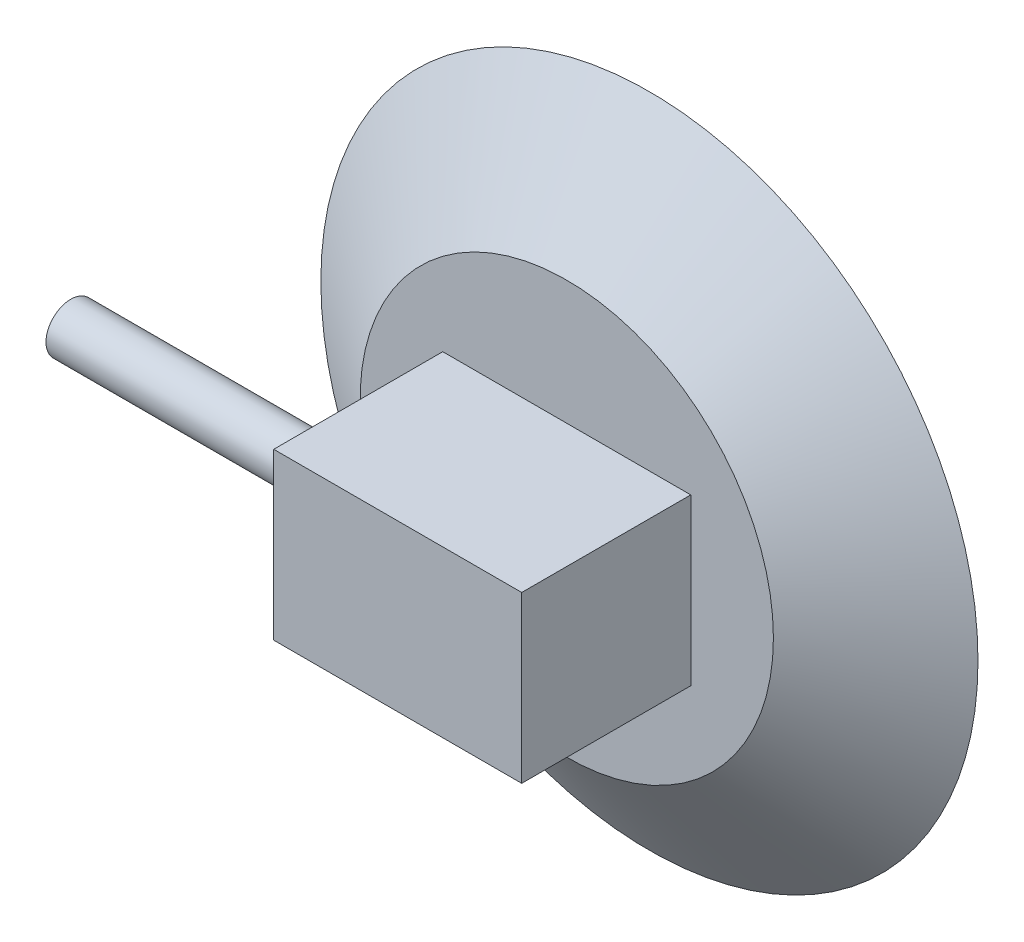
ISO-10303-21;
HEADER;
FILE_DESCRIPTION(('STEP AP214'),'2;1');
FILE_NAME('part.step','',(''),(''),'','','');
FILE_SCHEMA(('AUTOMOTIVE_DESIGN { 1 0 10303 214 1 1 1 1 }'));
ENDSEC;
DATA;
#1=APPLICATION_CONTEXT('core data for automotive mechanical design processes');
#2=APPLICATION_PROTOCOL_DEFINITION('international standard','automotive_design',2000,#1);
#3=PRODUCT_CONTEXT('',#1,'mechanical');
#4=PRODUCT('Part','Part','',(#3));
#5=PRODUCT_RELATED_PRODUCT_CATEGORY('part','',(#4));
#6=PRODUCT_DEFINITION_FORMATION('','',#4);
#7=PRODUCT_DEFINITION_CONTEXT('part definition',#1,'design');
#8=PRODUCT_DEFINITION('design','',#6,#7);
#9=PRODUCT_DEFINITION_SHAPE('','',#8);
#10=(LENGTH_UNIT() NAMED_UNIT(*) SI_UNIT(.MILLI.,.METRE.));
#11=(NAMED_UNIT(*) PLANE_ANGLE_UNIT() SI_UNIT($,.RADIAN.));
#12=(NAMED_UNIT(*) SI_UNIT($,.STERADIAN.) SOLID_ANGLE_UNIT());
#13=UNCERTAINTY_MEASURE_WITH_UNIT(LENGTH_MEASURE(1.E-05),#10,'distance_accuracy_value','');
#14=(GEOMETRIC_REPRESENTATION_CONTEXT(3) GLOBAL_UNCERTAINTY_ASSIGNED_CONTEXT((#13)) GLOBAL_UNIT_ASSIGNED_CONTEXT((#10,
#11,#12)) REPRESENTATION_CONTEXT('',''));
#15=CARTESIAN_POINT('',(0.,0.,0.));
#16=DIRECTION('',(0.,0.,1.));
#17=DIRECTION('',(1.,0.,0.));
#18=AXIS2_PLACEMENT_3D('',#15,#16,#17);
#19=CARTESIAN_POINT('',(0.,0.,20.));
#20=DIRECTION('',(0.,0.,1.));
#21=DIRECTION('',(1.,0.,0.));
#22=AXIS2_PLACEMENT_3D('',#19,#20,#21);
#23=PLANE('',#22);
#24=CARTESIAN_POINT('',(0.,0.,20.));
#25=DIRECTION('',(0.,0.,1.));
#26=DIRECTION('',(1.,0.,0.));
#27=AXIS2_PLACEMENT_3D('',#24,#25,#26);
#28=CIRCLE('',#27,50.);
#29=CARTESIAN_POINT('',(50.,0.,20.));
#30=VERTEX_POINT('',#29);
#31=EDGE_CURVE('E12',#30,#30,#28,.T.);
#32=ORIENTED_EDGE('',*,*,#31,.T.);
#33=EDGE_LOOP('',(#32));
#34=FACE_BOUND('',#33,.T.);
#35=DIRECTION('',(0.,-1.,0.));
#36=VECTOR('',#35,1.);
#37=CARTESIAN_POINT('',(-30.,20.,20.));
#38=LINE('',#37,#36);
#39=CARTESIAN_POINT('',(-30.,-10.,20.));
#40=VERTEX_POINT('',#39);
#41=CARTESIAN_POINT('',(-30.,-20.,20.));
#42=VERTEX_POINT('',#41);
#43=EDGE_CURVE('E161',#40,#42,#38,.T.);
#44=ORIENTED_EDGE('',*,*,#43,.F.);
#45=DIRECTION('',(1.,0.,0.));
#46=VECTOR('',#45,1.);
#47=CARTESIAN_POINT('',(-40.,-10.,20.));
#48=LINE('',#47,#46);
#49=CARTESIAN_POINT('',(-40.,-10.,20.));
#50=VERTEX_POINT('',#49);
#51=EDGE_CURVE('E66',#50,#40,#48,.T.);
#52=ORIENTED_EDGE('',*,*,#51,.F.);
#53=DIRECTION('',(0.,-1.,0.));
#54=VECTOR('',#53,1.);
#55=CARTESIAN_POINT('',(-40.,10.,20.));
#56=LINE('',#55,#54);
#57=CARTESIAN_POINT('',(-40.,10.,20.));
#58=VERTEX_POINT('',#57);
#59=EDGE_CURVE('E71',#58,#50,#56,.T.);
#60=ORIENTED_EDGE('',*,*,#59,.F.);
#61=DIRECTION('',(1.,0.,0.));
#62=VECTOR('',#61,1.);
#63=CARTESIAN_POINT('',(-40.,10.,20.));
#64=LINE('',#63,#62);
#65=CARTESIAN_POINT('',(-30.,10.,20.));
#66=VERTEX_POINT('',#65);
#67=EDGE_CURVE('E141',#58,#66,#64,.T.);
#68=ORIENTED_EDGE('',*,*,#67,.T.);
#69=CARTESIAN_POINT('',(-30.,20.,20.));
#70=VERTEX_POINT('',#69);
#71=EDGE_CURVE('E177',#70,#66,#38,.T.);
#72=ORIENTED_EDGE('',*,*,#71,.F.);
#73=DIRECTION('',(-1.,0.,0.));
#74=VECTOR('',#73,1.);
#75=CARTESIAN_POINT('',(-30.,20.,20.));
#76=LINE('',#75,#74);
#77=CARTESIAN_POINT('',(30.,20.,20.));
#78=VERTEX_POINT('',#77);
#79=EDGE_CURVE('E167',#78,#70,#76,.T.);
#80=ORIENTED_EDGE('',*,*,#79,.F.);
#81=DIRECTION('',(0.,1.,0.));
#82=VECTOR('',#81,1.);
#83=CARTESIAN_POINT('',(30.,20.,20.));
#84=LINE('',#83,#82);
#85=CARTESIAN_POINT('',(30.,-20.,20.));
#86=VERTEX_POINT('',#85);
#87=EDGE_CURVE('E184',#86,#78,#84,.T.);
#88=ORIENTED_EDGE('',*,*,#87,.F.);
#89=DIRECTION('',(1.,0.,0.));
#90=VECTOR('',#89,1.);
#91=CARTESIAN_POINT('',(-30.,-20.,20.));
#92=LINE('',#91,#90);
#93=EDGE_CURVE('E180',#42,#86,#92,.T.);
#94=ORIENTED_EDGE('',*,*,#93,.F.);
#95=EDGE_LOOP('',(#44,#52,#60,#68,#72,#80,#88,#94));
#96=FACE_BOUND('',#95,.T.);
#97=ADVANCED_FACE('F49',(#34,#96),#23,.T.);
#98=CARTESIAN_POINT('',(-30.,20.,60.9));
#99=DIRECTION('',(1.,0.,0.));
#100=DIRECTION('',(0.,0.,-1.));
#101=AXIS2_PLACEMENT_3D('',#98,#99,#100);
#102=PLANE('',#101);
#103=DIRECTION('',(0.,0.,1.));
#104=VECTOR('',#103,1.);
#105=CARTESIAN_POINT('',(-30.,-10.,20.));
#106=LINE('',#105,#104);
#107=CARTESIAN_POINT('',(-30.,-10.,40.));
#108=VERTEX_POINT('',#107);
#109=EDGE_CURVE('E128',#40,#108,#106,.T.);
#110=ORIENTED_EDGE('',*,*,#109,.F.);
#111=ORIENTED_EDGE('',*,*,#43,.T.);
#112=DIRECTION('',(0.,0.,-1.));
#113=VECTOR('',#112,1.);
#114=CARTESIAN_POINT('',(-30.,-20.,60.9));
#115=LINE('',#114,#113);
#116=CARTESIAN_POINT('',(-30.,-20.,60.9));
#117=VERTEX_POINT('',#116);
#118=EDGE_CURVE('E202',#117,#42,#115,.T.);
#119=ORIENTED_EDGE('',*,*,#118,.F.);
#120=DIRECTION('',(0.,-1.,0.));
#121=VECTOR('',#120,1.);
#122=CARTESIAN_POINT('',(-30.,20.,60.9));
#123=LINE('',#122,#121);
#124=CARTESIAN_POINT('',(-30.,20.,60.9));
#125=VERTEX_POINT('',#124);
#126=EDGE_CURVE('E162',#125,#117,#123,.T.);
#127=ORIENTED_EDGE('',*,*,#126,.F.);
#128=DIRECTION('',(0.,0.,-1.));
#129=VECTOR('',#128,1.);
#130=CARTESIAN_POINT('',(-30.,20.,60.9));
#131=LINE('',#130,#129);
#132=EDGE_CURVE('E176',#125,#70,#131,.T.);
#133=ORIENTED_EDGE('',*,*,#132,.T.);
#134=ORIENTED_EDGE('',*,*,#71,.T.);
#135=DIRECTION('',(0.,0.,-1.));
#136=VECTOR('',#135,1.);
#137=CARTESIAN_POINT('',(-30.,10.,20.));
#138=LINE('',#137,#136);
#139=CARTESIAN_POINT('',(-30.,10.,40.));
#140=VERTEX_POINT('',#139);
#141=EDGE_CURVE('E151',#140,#66,#138,.T.);
#142=ORIENTED_EDGE('',*,*,#141,.F.);
#143=CARTESIAN_POINT('',(-30.,0.,40.));
#144=DIRECTION('',(-1.,0.,0.));
#145=DIRECTION('',(0.,0.,1.));
#146=AXIS2_PLACEMENT_3D('',#143,#144,#145);
#147=CIRCLE('',#146,10.);
#148=EDGE_CURVE('E147',#108,#140,#147,.T.);
#149=ORIENTED_EDGE('',*,*,#148,.F.);
#150=EDGE_LOOP('',(#110,#111,#119,#127,#133,#134,#142,#149));
#151=FACE_BOUND('',#150,.T.);
#152=ADVANCED_FACE('F262',(#151),#102,.F.);
#153=CARTESIAN_POINT('',(0.,0.,0.));
#154=DIRECTION('',(0.,0.,1.));
#155=DIRECTION('',(1.,0.,0.));
#156=AXIS2_PLACEMENT_3D('',#153,#154,#155);
#157=PLANE('',#156);
#158=CARTESIAN_POINT('',(0.,0.,0.));
#159=DIRECTION('',(0.,0.,1.));
#160=DIRECTION('',(1.,0.,0.));
#161=AXIS2_PLACEMENT_3D('',#158,#159,#160);
#162=CIRCLE('',#161,79.5);
#163=CARTESIAN_POINT('',(79.5,0.,0.));
#164=VERTEX_POINT('',#163);
#165=EDGE_CURVE('E59',#164,#164,#162,.T.);
#166=ORIENTED_EDGE('',*,*,#165,.F.);
#167=EDGE_LOOP('',(#166));
#168=FACE_BOUND('',#167,.T.);
#169=ADVANCED_FACE('F225',(#168),#157,.F.);
#170=CARTESIAN_POINT('',(0.,0.,20.));
#171=DIRECTION('',(0.,0.,-1.));
#172=DIRECTION('',(-1.,0.,0.));
#173=AXIS2_PLACEMENT_3D('',#170,#171,#172);
#174=CONICAL_SURFACE('',#173,50.,0.975011779171838);
#175=ORIENTED_EDGE('',*,*,#165,.T.);
#176=EDGE_LOOP('',(#175));
#177=FACE_BOUND('',#176,.T.);
#178=ORIENTED_EDGE('',*,*,#31,.F.);
#179=EDGE_LOOP('',(#178));
#180=FACE_BOUND('',#179,.T.);
#181=ADVANCED_FACE('F215',(#177,#180),#174,.T.);
#182=CARTESIAN_POINT('',(-30.,-20.,60.9));
#183=DIRECTION('',(0.,1.,0.));
#184=DIRECTION('',(0.,0.,1.));
#185=AXIS2_PLACEMENT_3D('',#182,#183,#184);
#186=PLANE('',#185);
#187=ORIENTED_EDGE('',*,*,#93,.T.);
#188=DIRECTION('',(0.,0.,-1.));
#189=VECTOR('',#188,1.);
#190=CARTESIAN_POINT('',(30.,-20.,60.9));
#191=LINE('',#190,#189);
#192=CARTESIAN_POINT('',(30.,-20.,60.9));
#193=VERTEX_POINT('',#192);
#194=EDGE_CURVE('E198',#193,#86,#191,.T.);
#195=ORIENTED_EDGE('',*,*,#194,.F.);
#196=DIRECTION('',(1.,0.,0.));
#197=VECTOR('',#196,1.);
#198=CARTESIAN_POINT('',(-30.,-20.,60.9));
#199=LINE('',#198,#197);
#200=EDGE_CURVE('E166',#117,#193,#199,.T.);
#201=ORIENTED_EDGE('',*,*,#200,.F.);
#202=ORIENTED_EDGE('',*,*,#118,.T.);
#203=EDGE_LOOP('',(#187,#195,#201,#202));
#204=FACE_BOUND('',#203,.T.);
#205=ADVANCED_FACE('F224',(#204),#186,.F.);
#206=CARTESIAN_POINT('',(30.,20.,60.9));
#207=DIRECTION('',(-1.,0.,0.));
#208=DIRECTION('',(0.,-1.,0.));
#209=AXIS2_PLACEMENT_3D('',#206,#207,#208);
#210=PLANE('',#209);
#211=ORIENTED_EDGE('',*,*,#87,.T.);
#212=DIRECTION('',(0.,0.,-1.));
#213=VECTOR('',#212,1.);
#214=CARTESIAN_POINT('',(30.,20.,60.9));
#215=LINE('',#214,#213);
#216=CARTESIAN_POINT('',(30.,20.,60.9));
#217=VERTEX_POINT('',#216);
#218=EDGE_CURVE('E194',#217,#78,#215,.T.);
#219=ORIENTED_EDGE('',*,*,#218,.F.);
#220=DIRECTION('',(0.,1.,0.));
#221=VECTOR('',#220,1.);
#222=CARTESIAN_POINT('',(30.,20.,60.9));
#223=LINE('',#222,#221);
#224=EDGE_CURVE('E170',#193,#217,#223,.T.);
#225=ORIENTED_EDGE('',*,*,#224,.F.);
#226=ORIENTED_EDGE('',*,*,#194,.T.);
#227=EDGE_LOOP('',(#211,#219,#225,#226));
#228=FACE_BOUND('',#227,.T.);
#229=ADVANCED_FACE('F281',(#228),#210,.F.);
#230=CARTESIAN_POINT('',(-30.,20.,60.9));
#231=DIRECTION('',(0.,-1.,0.));
#232=DIRECTION('',(1.,0.,0.));
#233=AXIS2_PLACEMENT_3D('',#230,#231,#232);
#234=PLANE('',#233);
#235=ORIENTED_EDGE('',*,*,#79,.T.);
#236=ORIENTED_EDGE('',*,*,#132,.F.);
#237=DIRECTION('',(-1.,0.,0.));
#238=VECTOR('',#237,1.);
#239=CARTESIAN_POINT('',(-30.,20.,60.9));
#240=LINE('',#239,#238);
#241=EDGE_CURVE('E173',#217,#125,#240,.T.);
#242=ORIENTED_EDGE('',*,*,#241,.F.);
#243=ORIENTED_EDGE('',*,*,#218,.T.);
#244=EDGE_LOOP('',(#235,#236,#242,#243));
#245=FACE_BOUND('',#244,.T.);
#246=ADVANCED_FACE('F273',(#245),#234,.F.);
#247=CARTESIAN_POINT('',(0.,0.,60.9));
#248=DIRECTION('',(0.,0.,1.));
#249=DIRECTION('',(1.,0.,0.));
#250=AXIS2_PLACEMENT_3D('',#247,#248,#249);
#251=PLANE('',#250);
#252=ORIENTED_EDGE('',*,*,#126,.T.);
#253=ORIENTED_EDGE('',*,*,#200,.T.);
#254=ORIENTED_EDGE('',*,*,#224,.T.);
#255=ORIENTED_EDGE('',*,*,#241,.T.);
#256=EDGE_LOOP('',(#252,#253,#254,#255));
#257=FACE_BOUND('',#256,.T.);
#258=ADVANCED_FACE('F277',(#257),#251,.T.);
#259=CARTESIAN_POINT('',(-40.,-10.,20.));
#260=DIRECTION('',(0.,1.,0.));
#261=DIRECTION('',(0.,0.,1.));
#262=AXIS2_PLACEMENT_3D('',#259,#260,#261);
#263=PLANE('',#262);
#264=ORIENTED_EDGE('',*,*,#109,.T.);
#265=DIRECTION('',(1.,0.,0.));
#266=VECTOR('',#265,1.);
#267=CARTESIAN_POINT('',(-40.,-10.,40.));
#268=LINE('',#267,#266);
#269=CARTESIAN_POINT('',(-40.,-10.,40.));
#270=VERTEX_POINT('',#269);
#271=EDGE_CURVE('E126',#270,#108,#268,.T.);
#272=ORIENTED_EDGE('',*,*,#271,.F.);
#273=DIRECTION('',(0.,0.,1.));
#274=VECTOR('',#273,1.);
#275=CARTESIAN_POINT('',(-40.,-10.,20.));
#276=LINE('',#275,#274);
#277=EDGE_CURVE('E115',#50,#270,#276,.T.);
#278=ORIENTED_EDGE('',*,*,#277,.F.);
#279=ORIENTED_EDGE('',*,*,#51,.T.);
#280=EDGE_LOOP('',(#264,#272,#278,#279));
#281=FACE_BOUND('',#280,.T.);
#282=ADVANCED_FACE('F127',(#281),#263,.F.);
#283=CARTESIAN_POINT('',(-40.,0.,40.));
#284=DIRECTION('',(1.,0.,0.));
#285=DIRECTION('',(0.,0.,-1.));
#286=AXIS2_PLACEMENT_3D('',#283,#284,#285);
#287=CYLINDRICAL_SURFACE('',#286,10.);
#288=ORIENTED_EDGE('',*,*,#148,.T.);
#289=DIRECTION('',(1.,0.,0.));
#290=VECTOR('',#289,1.);
#291=CARTESIAN_POINT('',(-40.,10.,40.));
#292=LINE('',#291,#290);
#293=CARTESIAN_POINT('',(-40.,10.,40.));
#294=VERTEX_POINT('',#293);
#295=EDGE_CURVE('E132',#294,#140,#292,.T.);
#296=ORIENTED_EDGE('',*,*,#295,.F.);
#297=CARTESIAN_POINT('',(-40.,0.,40.));
#298=DIRECTION('',(-1.,0.,0.));
#299=DIRECTION('',(0.,0.,1.));
#300=AXIS2_PLACEMENT_3D('',#297,#298,#299);
#301=CIRCLE('',#300,10.);
#302=EDGE_CURVE('E119',#270,#294,#301,.T.);
#303=ORIENTED_EDGE('',*,*,#302,.F.);
#304=ORIENTED_EDGE('',*,*,#271,.T.);
#305=EDGE_LOOP('',(#288,#296,#303,#304));
#306=FACE_BOUND('',#305,.T.);
#307=ADVANCED_FACE('F134',(#306),#287,.T.);
#308=CARTESIAN_POINT('',(-40.,10.,20.));
#309=DIRECTION('',(0.,-1.,0.));
#310=DIRECTION('',(0.,0.,-1.));
#311=AXIS2_PLACEMENT_3D('',#308,#309,#310);
#312=PLANE('',#311);
#313=ORIENTED_EDGE('',*,*,#141,.T.);
#314=ORIENTED_EDGE('',*,*,#67,.F.);
#315=DIRECTION('',(0.,0.,-1.));
#316=VECTOR('',#315,1.);
#317=CARTESIAN_POINT('',(-40.,10.,20.));
#318=LINE('',#317,#316);
#319=EDGE_CURVE('E138',#294,#58,#318,.T.);
#320=ORIENTED_EDGE('',*,*,#319,.F.);
#321=ORIENTED_EDGE('',*,*,#295,.T.);
#322=EDGE_LOOP('',(#313,#314,#320,#321));
#323=FACE_BOUND('',#322,.T.);
#324=ADVANCED_FACE('F269',(#323),#312,.F.);
#325=CARTESIAN_POINT('',(-40.,0.,40.));
#326=DIRECTION('',(-1.,0.,0.));
#327=DIRECTION('',(0.,0.,1.));
#328=AXIS2_PLACEMENT_3D('',#325,#326,#327);
#329=PLANE('',#328);
#330=CARTESIAN_POINT('',(-40.,0.,40.));
#331=DIRECTION('',(-1.,0.,0.));
#332=DIRECTION('',(0.,0.,1.));
#333=AXIS2_PLACEMENT_3D('',#330,#331,#332);
#334=CIRCLE('',#333,5.99999999999999);
#335=CARTESIAN_POINT('',(-40.,0.,46.));
#336=VERTEX_POINT('',#335);
#337=EDGE_CURVE('E395',#336,#336,#334,.T.);
#338=ORIENTED_EDGE('',*,*,#337,.F.);
#339=EDGE_LOOP('',(#338));
#340=FACE_BOUND('',#339,.T.);
#341=ORIENTED_EDGE('',*,*,#59,.T.);
#342=ORIENTED_EDGE('',*,*,#277,.T.);
#343=ORIENTED_EDGE('',*,*,#302,.T.);
#344=ORIENTED_EDGE('',*,*,#319,.T.);
#345=EDGE_LOOP('',(#341,#342,#343,#344));
#346=FACE_BOUND('',#345,.T.);
#347=ADVANCED_FACE('F117',(#340,#346),#329,.T.);
#348=CARTESIAN_POINT('',(-100.,0.,40.));
#349=DIRECTION('',(1.,0.,0.));
#350=DIRECTION('',(0.,0.,-1.));
#351=AXIS2_PLACEMENT_3D('',#348,#349,#350);
#352=CYLINDRICAL_SURFACE('',#351,5.99999999999999);
#353=CARTESIAN_POINT('',(-100.,0.,40.));
#354=DIRECTION('',(-1.,0.,0.));
#355=DIRECTION('',(0.,0.,1.));
#356=AXIS2_PLACEMENT_3D('',#353,#354,#355);
#357=CIRCLE('',#356,5.99999999999999);
#358=CARTESIAN_POINT('',(-100.,0.,46.));
#359=VERTEX_POINT('',#358);
#360=EDGE_CURVE('E148',#359,#359,#357,.T.);
#361=ORIENTED_EDGE('',*,*,#360,.F.);
#362=EDGE_LOOP('',(#361));
#363=FACE_BOUND('',#362,.T.);
#364=ORIENTED_EDGE('',*,*,#337,.T.);
#365=EDGE_LOOP('',(#364));
#366=FACE_BOUND('',#365,.T.);
#367=ADVANCED_FACE('F369',(#363,#366),#352,.T.);
#368=CARTESIAN_POINT('',(-100.,0.,40.));
#369=DIRECTION('',(-1.,0.,0.));
#370=DIRECTION('',(0.,0.,1.));
#371=AXIS2_PLACEMENT_3D('',#368,#369,#370);
#372=PLANE('',#371);
#373=ORIENTED_EDGE('',*,*,#360,.T.);
#374=EDGE_LOOP('',(#373));
#375=FACE_BOUND('',#374,.T.);
#376=ADVANCED_FACE('F379',(#375),#372,.T.);
#377=CLOSED_SHELL('',(#97,#152,#169,#181,#205,#229,#246,#258,#282,#307,#324,#347,#367,#376));
#378=MANIFOLD_SOLID_BREP('B2',#377);
#379=ADVANCED_BREP_SHAPE_REPRESENTATION('',(#18,#378),#14);
#380=SHAPE_DEFINITION_REPRESENTATION(#9,#379);
ENDSEC;
END-ISO-10303-21;
